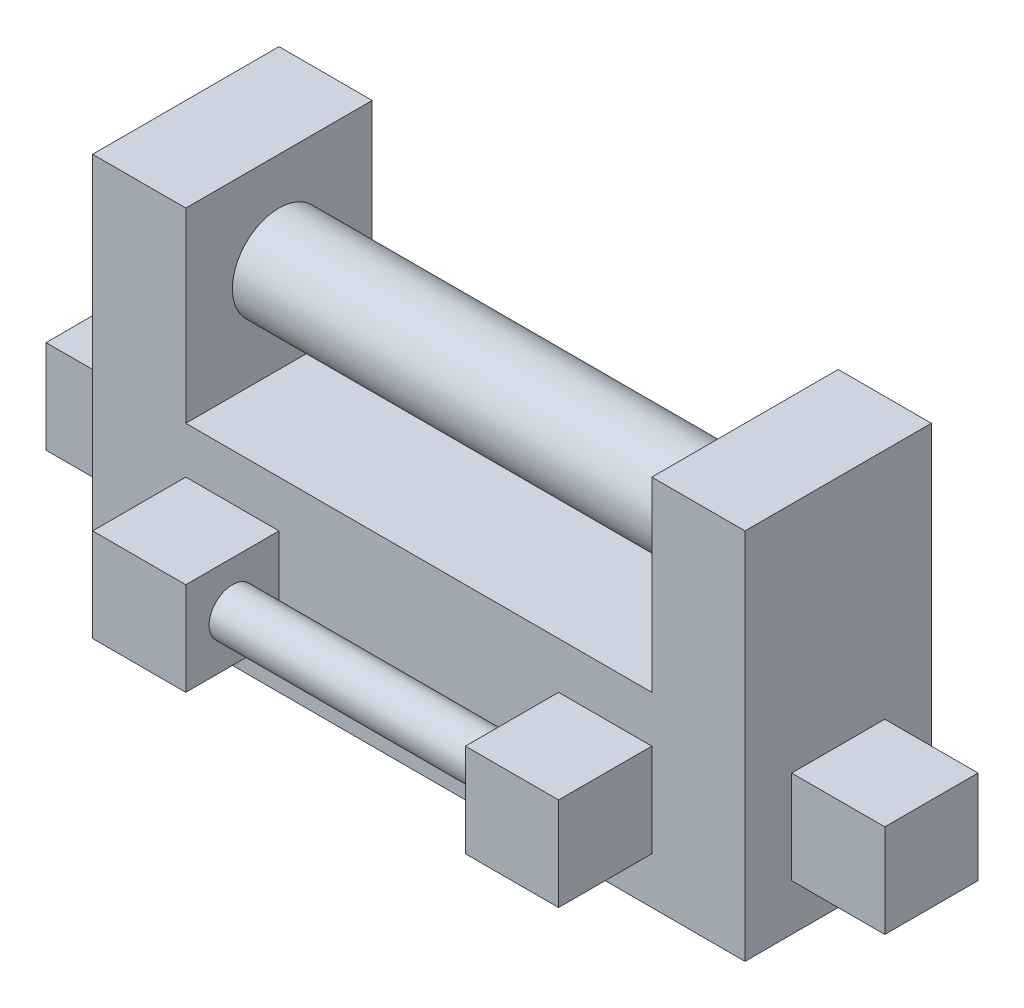
ISO-10303-21;
HEADER;
FILE_DESCRIPTION(('STEP AP214'),'2;1');
FILE_NAME('part.step','',(''),(''),'','','');
FILE_SCHEMA(('AUTOMOTIVE_DESIGN { 1 0 10303 214 1 1 1 1 }'));
ENDSEC;
DATA;
#1=APPLICATION_CONTEXT('core data for automotive mechanical design processes');
#2=APPLICATION_PROTOCOL_DEFINITION('international standard','automotive_design',2000,#1);
#3=PRODUCT_CONTEXT('',#1,'mechanical');
#4=PRODUCT('Part','Part','',(#3));
#5=PRODUCT_RELATED_PRODUCT_CATEGORY('part','',(#4));
#6=PRODUCT_DEFINITION_FORMATION('','',#4);
#7=PRODUCT_DEFINITION_CONTEXT('part definition',#1,'design');
#8=PRODUCT_DEFINITION('design','',#6,#7);
#9=PRODUCT_DEFINITION_SHAPE('','',#8);
#10=(LENGTH_UNIT() NAMED_UNIT(*) SI_UNIT(.MILLI.,.METRE.));
#11=(NAMED_UNIT(*) PLANE_ANGLE_UNIT() SI_UNIT($,.RADIAN.));
#12=(NAMED_UNIT(*) SI_UNIT($,.STERADIAN.) SOLID_ANGLE_UNIT());
#13=UNCERTAINTY_MEASURE_WITH_UNIT(LENGTH_MEASURE(1.E-05),#10,'distance_accuracy_value','');
#14=(GEOMETRIC_REPRESENTATION_CONTEXT(3) GLOBAL_UNCERTAINTY_ASSIGNED_CONTEXT((#13)) GLOBAL_UNIT_ASSIGNED_CONTEXT((#10,
#11,#12)) REPRESENTATION_CONTEXT('',''));
#15=CARTESIAN_POINT('',(0.,0.,0.));
#16=DIRECTION('',(0.,0.,1.));
#17=DIRECTION('',(1.,0.,0.));
#18=AXIS2_PLACEMENT_3D('',#15,#16,#17);
#19=CARTESIAN_POINT('',(0.,0.,10.));
#20=DIRECTION('',(0.,-1.,0.));
#21=DIRECTION('',(1.,0.,0.));
#22=AXIS2_PLACEMENT_3D('',#19,#20,#21);
#23=PLANE('',#22);
#24=DIRECTION('',(-1.,0.,0.));
#25=VECTOR('',#24,1.);
#26=CARTESIAN_POINT('',(0.,0.,-10.));
#27=LINE('',#26,#25);
#28=CARTESIAN_POINT('',(70.,0.,-10.));
#29=VERTEX_POINT('',#28);
#30=CARTESIAN_POINT('',(0.,0.,-10.));
#31=VERTEX_POINT('',#30);
#32=EDGE_CURVE('E440',#29,#31,#27,.T.);
#33=ORIENTED_EDGE('',*,*,#32,.F.);
#34=DIRECTION('',(0.,0.,-1.));
#35=VECTOR('',#34,1.);
#36=CARTESIAN_POINT('',(70.,0.,10.));
#37=LINE('',#36,#35);
#38=CARTESIAN_POINT('',(70.,0.,10.));
#39=VERTEX_POINT('',#38);
#40=EDGE_CURVE('E476',#39,#29,#37,.T.);
#41=ORIENTED_EDGE('',*,*,#40,.F.);
#42=DIRECTION('',(-1.,0.,0.));
#43=VECTOR('',#42,1.);
#44=CARTESIAN_POINT('',(0.,0.,10.));
#45=LINE('',#44,#43);
#46=CARTESIAN_POINT('',(0.,0.,10.));
#47=VERTEX_POINT('',#46);
#48=EDGE_CURVE('E396',#39,#47,#45,.T.);
#49=ORIENTED_EDGE('',*,*,#48,.T.);
#50=DIRECTION('',(0.,0.,-1.));
#51=VECTOR('',#50,1.);
#52=CARTESIAN_POINT('',(0.,0.,10.));
#53=LINE('',#52,#51);
#54=EDGE_CURVE('E420',#47,#31,#53,.T.);
#55=ORIENTED_EDGE('',*,*,#54,.T.);
#56=EDGE_LOOP('',(#33,#41,#49,#55));
#57=FACE_BOUND('',#56,.T.);
#58=ADVANCED_FACE('F39',(#57),#23,.T.);
#59=CARTESIAN_POINT('',(70.,0.,10.));
#60=DIRECTION('',(1.,0.,0.));
#61=DIRECTION('',(0.,0.,-1.));
#62=AXIS2_PLACEMENT_3D('',#59,#60,#61);
#63=PLANE('',#62);
#64=DIRECTION('',(0.,-1.,0.));
#65=VECTOR('',#64,1.);
#66=CARTESIAN_POINT('',(70.,0.,5.));
#67=LINE('',#66,#65);
#68=CARTESIAN_POINT('',(70.,15.,5.));
#69=VERTEX_POINT('',#68);
#70=CARTESIAN_POINT('',(70.,5.,5.));
#71=VERTEX_POINT('',#70);
#72=EDGE_CURVE('E354',#69,#71,#67,.T.);
#73=ORIENTED_EDGE('',*,*,#72,.F.);
#74=DIRECTION('',(0.,0.,-1.));
#75=VECTOR('',#74,1.);
#76=CARTESIAN_POINT('',(70.,15.,5.));
#77=LINE('',#76,#75);
#78=CARTESIAN_POINT('',(70.,15.,-5.));
#79=VERTEX_POINT('',#78);
#80=EDGE_CURVE('E367',#69,#79,#77,.T.);
#81=ORIENTED_EDGE('',*,*,#80,.T.);
#82=DIRECTION('',(0.,-1.,0.));
#83=VECTOR('',#82,1.);
#84=CARTESIAN_POINT('',(70.,0.,-5.));
#85=LINE('',#84,#83);
#86=CARTESIAN_POINT('',(70.,5.,-5.));
#87=VERTEX_POINT('',#86);
#88=EDGE_CURVE('E349',#79,#87,#85,.T.);
#89=ORIENTED_EDGE('',*,*,#88,.T.);
#90=DIRECTION('',(0.,0.,-1.));
#91=VECTOR('',#90,1.);
#92=CARTESIAN_POINT('',(70.,5.,5.));
#93=LINE('',#92,#91);
#94=EDGE_CURVE('E356',#71,#87,#93,.T.);
#95=ORIENTED_EDGE('',*,*,#94,.F.);
#96=EDGE_LOOP('',(#73,#81,#89,#95));
#97=FACE_BOUND('',#96,.T.);
#98=DIRECTION('',(0.,-1.,0.));
#99=VECTOR('',#98,1.);
#100=CARTESIAN_POINT('',(70.,0.,-10.));
#101=LINE('',#100,#99);
#102=CARTESIAN_POINT('',(70.,40.,-10.));
#103=VERTEX_POINT('',#102);
#104=EDGE_CURVE('E443',#103,#29,#101,.T.);
#105=ORIENTED_EDGE('',*,*,#104,.F.);
#106=DIRECTION('',(0.,0.,-1.));
#107=VECTOR('',#106,1.);
#108=CARTESIAN_POINT('',(70.,40.,10.));
#109=LINE('',#108,#107);
#110=CARTESIAN_POINT('',(70.,40.,10.));
#111=VERTEX_POINT('',#110);
#112=EDGE_CURVE('E474',#111,#103,#109,.T.);
#113=ORIENTED_EDGE('',*,*,#112,.F.);
#114=DIRECTION('',(0.,-1.,0.));
#115=VECTOR('',#114,1.);
#116=CARTESIAN_POINT('',(70.,0.,10.));
#117=LINE('',#116,#115);
#118=EDGE_CURVE('E399',#111,#39,#117,.T.);
#119=ORIENTED_EDGE('',*,*,#118,.T.);
#120=ORIENTED_EDGE('',*,*,#40,.T.);
#121=EDGE_LOOP('',(#105,#113,#119,#120));
#122=FACE_BOUND('',#121,.T.);
#123=ADVANCED_FACE('F521',(#97,#122),#63,.T.);
#124=CARTESIAN_POINT('',(0.,40.,10.));
#125=DIRECTION('',(0.,1.,0.));
#126=DIRECTION('',(0.,0.,1.));
#127=AXIS2_PLACEMENT_3D('',#124,#125,#126);
#128=PLANE('',#127);
#129=DIRECTION('',(1.,0.,0.));
#130=VECTOR('',#129,1.);
#131=CARTESIAN_POINT('',(0.,40.,-10.));
#132=LINE('',#131,#130);
#133=CARTESIAN_POINT('',(60.,40.,-10.));
#134=VERTEX_POINT('',#133);
#135=EDGE_CURVE('E446',#134,#103,#132,.T.);
#136=ORIENTED_EDGE('',*,*,#135,.F.);
#137=DIRECTION('',(0.,0.,-1.));
#138=VECTOR('',#137,1.);
#139=CARTESIAN_POINT('',(60.,40.,10.));
#140=LINE('',#139,#138);
#141=CARTESIAN_POINT('',(60.,40.,10.));
#142=VERTEX_POINT('',#141);
#143=EDGE_CURVE('E472',#142,#134,#140,.T.);
#144=ORIENTED_EDGE('',*,*,#143,.F.);
#145=DIRECTION('',(1.,0.,0.));
#146=VECTOR('',#145,1.);
#147=CARTESIAN_POINT('',(0.,40.,10.));
#148=LINE('',#147,#146);
#149=EDGE_CURVE('E402',#142,#111,#148,.T.);
#150=ORIENTED_EDGE('',*,*,#149,.T.);
#151=ORIENTED_EDGE('',*,*,#112,.T.);
#152=EDGE_LOOP('',(#136,#144,#150,#151));
#153=FACE_BOUND('',#152,.T.);
#154=ADVANCED_FACE('F526',(#153),#128,.T.);
#155=CARTESIAN_POINT('',(60.,0.,10.));
#156=DIRECTION('',(-1.,0.,0.));
#157=DIRECTION('',(0.,0.,1.));
#158=AXIS2_PLACEMENT_3D('',#155,#156,#157);
#159=PLANE('',#158);
#160=CARTESIAN_POINT('',(60.,30.,0.));
#161=DIRECTION('',(-1.,0.,0.));
#162=DIRECTION('',(0.,0.,1.));
#163=AXIS2_PLACEMENT_3D('',#160,#161,#162);
#164=CIRCLE('',#163,5.);
#165=CARTESIAN_POINT('',(60.,30.,5.));
#166=VERTEX_POINT('',#165);
#167=EDGE_CURVE('E1005',#166,#166,#164,.T.);
#168=ORIENTED_EDGE('',*,*,#167,.F.);
#169=EDGE_LOOP('',(#168));
#170=FACE_BOUND('',#169,.T.);
#171=DIRECTION('',(0.,1.,0.));
#172=VECTOR('',#171,1.);
#173=CARTESIAN_POINT('',(60.,0.,-10.));
#174=LINE('',#173,#172);
#175=CARTESIAN_POINT('',(60.,20.,-10.));
#176=VERTEX_POINT('',#175);
#177=EDGE_CURVE('E449',#176,#134,#174,.T.);
#178=ORIENTED_EDGE('',*,*,#177,.F.);
#179=DIRECTION('',(0.,0.,-1.));
#180=VECTOR('',#179,1.);
#181=CARTESIAN_POINT('',(60.,20.,10.));
#182=LINE('',#181,#180);
#183=CARTESIAN_POINT('',(60.,20.,10.));
#184=VERTEX_POINT('',#183);
#185=EDGE_CURVE('E470',#184,#176,#182,.T.);
#186=ORIENTED_EDGE('',*,*,#185,.F.);
#187=DIRECTION('',(0.,1.,0.));
#188=VECTOR('',#187,1.);
#189=CARTESIAN_POINT('',(60.,0.,10.));
#190=LINE('',#189,#188);
#191=EDGE_CURVE('E405',#184,#142,#190,.T.);
#192=ORIENTED_EDGE('',*,*,#191,.T.);
#193=ORIENTED_EDGE('',*,*,#143,.T.);
#194=EDGE_LOOP('',(#178,#186,#192,#193));
#195=FACE_BOUND('',#194,.T.);
#196=ADVANCED_FACE('F543',(#170,#195),#159,.T.);
#197=CARTESIAN_POINT('',(0.,20.,10.));
#198=DIRECTION('',(0.,1.,0.));
#199=DIRECTION('',(0.,0.,1.));
#200=AXIS2_PLACEMENT_3D('',#197,#198,#199);
#201=PLANE('',#200);
#202=DIRECTION('',(1.,0.,0.));
#203=VECTOR('',#202,1.);
#204=CARTESIAN_POINT('',(0.,20.,-10.));
#205=LINE('',#204,#203);
#206=CARTESIAN_POINT('',(10.,20.,-10.));
#207=VERTEX_POINT('',#206);
#208=EDGE_CURVE('E452',#207,#176,#205,.T.);
#209=ORIENTED_EDGE('',*,*,#208,.F.);
#210=DIRECTION('',(0.,0.,-1.));
#211=VECTOR('',#210,1.);
#212=CARTESIAN_POINT('',(10.,20.,10.));
#213=LINE('',#212,#211);
#214=CARTESIAN_POINT('',(10.,20.,10.));
#215=VERTEX_POINT('',#214);
#216=EDGE_CURVE('E468',#215,#207,#213,.T.);
#217=ORIENTED_EDGE('',*,*,#216,.F.);
#218=DIRECTION('',(1.,0.,0.));
#219=VECTOR('',#218,1.);
#220=CARTESIAN_POINT('',(0.,20.,10.));
#221=LINE('',#220,#219);
#222=EDGE_CURVE('E408',#215,#184,#221,.T.);
#223=ORIENTED_EDGE('',*,*,#222,.T.);
#224=ORIENTED_EDGE('',*,*,#185,.T.);
#225=EDGE_LOOP('',(#209,#217,#223,#224));
#226=FACE_BOUND('',#225,.T.);
#227=ADVANCED_FACE('F548',(#226),#201,.T.);
#228=CARTESIAN_POINT('',(10.,0.,10.));
#229=DIRECTION('',(1.,0.,0.));
#230=DIRECTION('',(0.,1.,0.));
#231=AXIS2_PLACEMENT_3D('',#228,#229,#230);
#232=PLANE('',#231);
#233=CARTESIAN_POINT('',(10.,30.,0.));
#234=DIRECTION('',(1.,0.,0.));
#235=DIRECTION('',(0.,1.,0.));
#236=AXIS2_PLACEMENT_3D('',#233,#234,#235);
#237=CIRCLE('',#236,5.);
#238=CARTESIAN_POINT('',(10.,35.,0.));
#239=VERTEX_POINT('',#238);
#240=EDGE_CURVE('E1007',#239,#239,#237,.T.);
#241=ORIENTED_EDGE('',*,*,#240,.F.);
#242=EDGE_LOOP('',(#241));
#243=FACE_BOUND('',#242,.T.);
#244=DIRECTION('',(0.,-1.,0.));
#245=VECTOR('',#244,1.);
#246=CARTESIAN_POINT('',(10.,0.,-10.));
#247=LINE('',#246,#245);
#248=CARTESIAN_POINT('',(10.,40.,-10.));
#249=VERTEX_POINT('',#248);
#250=EDGE_CURVE('E455',#249,#207,#247,.T.);
#251=ORIENTED_EDGE('',*,*,#250,.F.);
#252=DIRECTION('',(0.,0.,-1.));
#253=VECTOR('',#252,1.);
#254=CARTESIAN_POINT('',(10.,40.,10.));
#255=LINE('',#254,#253);
#256=CARTESIAN_POINT('',(10.,40.,10.));
#257=VERTEX_POINT('',#256);
#258=EDGE_CURVE('E466',#257,#249,#255,.T.);
#259=ORIENTED_EDGE('',*,*,#258,.F.);
#260=DIRECTION('',(0.,-1.,0.));
#261=VECTOR('',#260,1.);
#262=CARTESIAN_POINT('',(10.,0.,10.));
#263=LINE('',#262,#261);
#264=EDGE_CURVE('E411',#257,#215,#263,.T.);
#265=ORIENTED_EDGE('',*,*,#264,.T.);
#266=ORIENTED_EDGE('',*,*,#216,.T.);
#267=EDGE_LOOP('',(#251,#259,#265,#266));
#268=FACE_BOUND('',#267,.T.);
#269=ADVANCED_FACE('F551',(#243,#268),#232,.T.);
#270=CARTESIAN_POINT('',(0.,40.,10.));
#271=DIRECTION('',(0.,1.,0.));
#272=DIRECTION('',(0.,0.,1.));
#273=AXIS2_PLACEMENT_3D('',#270,#271,#272);
#274=PLANE('',#273);
#275=DIRECTION('',(1.,0.,0.));
#276=VECTOR('',#275,1.);
#277=CARTESIAN_POINT('',(0.,40.,-10.));
#278=LINE('',#277,#276);
#279=CARTESIAN_POINT('',(0.,40.,-10.));
#280=VERTEX_POINT('',#279);
#281=EDGE_CURVE('E458',#280,#249,#278,.T.);
#282=ORIENTED_EDGE('',*,*,#281,.F.);
#283=DIRECTION('',(0.,0.,-1.));
#284=VECTOR('',#283,1.);
#285=CARTESIAN_POINT('',(0.,40.,10.));
#286=LINE('',#285,#284);
#287=CARTESIAN_POINT('',(0.,40.,10.));
#288=VERTEX_POINT('',#287);
#289=EDGE_CURVE('E464',#288,#280,#286,.T.);
#290=ORIENTED_EDGE('',*,*,#289,.F.);
#291=DIRECTION('',(1.,0.,0.));
#292=VECTOR('',#291,1.);
#293=CARTESIAN_POINT('',(0.,40.,10.));
#294=LINE('',#293,#292);
#295=EDGE_CURVE('E414',#288,#257,#294,.T.);
#296=ORIENTED_EDGE('',*,*,#295,.T.);
#297=ORIENTED_EDGE('',*,*,#258,.T.);
#298=EDGE_LOOP('',(#282,#290,#296,#297));
#299=FACE_BOUND('',#298,.T.);
#300=ADVANCED_FACE('F555',(#299),#274,.T.);
#301=CARTESIAN_POINT('',(0.,0.,10.));
#302=DIRECTION('',(-1.,0.,0.));
#303=DIRECTION('',(0.,0.,1.));
#304=AXIS2_PLACEMENT_3D('',#301,#302,#303);
#305=PLANE('',#304);
#306=DIRECTION('',(0.,1.,0.));
#307=VECTOR('',#306,1.);
#308=CARTESIAN_POINT('',(0.,0.,5.));
#309=LINE('',#308,#307);
#310=CARTESIAN_POINT('',(0.,4.99999999999999,5.));
#311=VERTEX_POINT('',#310);
#312=CARTESIAN_POINT('',(0.,15.,5.));
#313=VERTEX_POINT('',#312);
#314=EDGE_CURVE('E324',#311,#313,#309,.T.);
#315=ORIENTED_EDGE('',*,*,#314,.F.);
#316=DIRECTION('',(0.,0.,-1.));
#317=VECTOR('',#316,1.);
#318=CARTESIAN_POINT('',(0.,4.99999999999999,5.));
#319=LINE('',#318,#317);
#320=CARTESIAN_POINT('',(0.,4.99999999999999,-5.));
#321=VERTEX_POINT('',#320);
#322=EDGE_CURVE('E340',#311,#321,#319,.T.);
#323=ORIENTED_EDGE('',*,*,#322,.T.);
#324=DIRECTION('',(0.,1.,0.));
#325=VECTOR('',#324,1.);
#326=CARTESIAN_POINT('',(0.,0.,-5.));
#327=LINE('',#326,#325);
#328=CARTESIAN_POINT('',(0.,15.,-5.));
#329=VERTEX_POINT('',#328);
#330=EDGE_CURVE('E333',#321,#329,#327,.T.);
#331=ORIENTED_EDGE('',*,*,#330,.T.);
#332=DIRECTION('',(0.,0.,-1.));
#333=VECTOR('',#332,1.);
#334=CARTESIAN_POINT('',(0.,15.,5.));
#335=LINE('',#334,#333);
#336=EDGE_CURVE('E338',#313,#329,#335,.T.);
#337=ORIENTED_EDGE('',*,*,#336,.F.);
#338=EDGE_LOOP('',(#315,#323,#331,#337));
#339=FACE_BOUND('',#338,.T.);
#340=DIRECTION('',(0.,1.,0.));
#341=VECTOR('',#340,1.);
#342=CARTESIAN_POINT('',(0.,0.,-10.));
#343=LINE('',#342,#341);
#344=EDGE_CURVE('E378',#31,#280,#343,.T.);
#345=ORIENTED_EDGE('',*,*,#344,.F.);
#346=ORIENTED_EDGE('',*,*,#54,.F.);
#347=DIRECTION('',(0.,1.,0.));
#348=VECTOR('',#347,1.);
#349=CARTESIAN_POINT('',(0.,0.,10.));
#350=LINE('',#349,#348);
#351=EDGE_CURVE('E417',#47,#288,#350,.T.);
#352=ORIENTED_EDGE('',*,*,#351,.T.);
#353=ORIENTED_EDGE('',*,*,#289,.T.);
#354=EDGE_LOOP('',(#345,#346,#352,#353));
#355=FACE_BOUND('',#354,.T.);
#356=ADVANCED_FACE('F557',(#339,#355),#305,.T.);
#357=CARTESIAN_POINT('',(0.,0.,10.));
#358=DIRECTION('',(0.,0.,1.));
#359=DIRECTION('',(1.,0.,0.));
#360=AXIS2_PLACEMENT_3D('',#357,#358,#359);
#361=PLANE('',#360);
#362=DIRECTION('',(0.,1.,0.));
#363=VECTOR('',#362,1.);
#364=CARTESIAN_POINT('',(60.,0.,10.));
#365=LINE('',#364,#363);
#366=CARTESIAN_POINT('',(60.,4.99999999999999,10.));
#367=VERTEX_POINT('',#366);
#368=CARTESIAN_POINT('',(60.,15.,10.));
#369=VERTEX_POINT('',#368);
#370=EDGE_CURVE('E376',#367,#369,#365,.T.);
#371=ORIENTED_EDGE('',*,*,#370,.F.);
#372=DIRECTION('',(1.,0.,0.));
#373=VECTOR('',#372,1.);
#374=CARTESIAN_POINT('',(0.,4.99999999999999,10.));
#375=LINE('',#374,#373);
#376=CARTESIAN_POINT('',(50.,4.99999999999999,10.));
#377=VERTEX_POINT('',#376);
#378=EDGE_CURVE('E273',#377,#367,#375,.T.);
#379=ORIENTED_EDGE('',*,*,#378,.F.);
#380=DIRECTION('',(0.,1.,0.));
#381=VECTOR('',#380,1.);
#382=CARTESIAN_POINT('',(50.,0.,10.));
#383=LINE('',#382,#381);
#384=CARTESIAN_POINT('',(50.,15.,10.));
#385=VERTEX_POINT('',#384);
#386=EDGE_CURVE('E380',#377,#385,#383,.T.);
#387=ORIENTED_EDGE('',*,*,#386,.T.);
#388=DIRECTION('',(1.,0.,0.));
#389=VECTOR('',#388,1.);
#390=CARTESIAN_POINT('',(0.,15.,10.));
#391=LINE('',#390,#389);
#392=EDGE_CURVE('E383',#385,#369,#391,.T.);
#393=ORIENTED_EDGE('',*,*,#392,.T.);
#394=EDGE_LOOP('',(#371,#379,#387,#393));
#395=FACE_BOUND('',#394,.T.);
#396=DIRECTION('',(0.,1.,0.));
#397=VECTOR('',#396,1.);
#398=CARTESIAN_POINT('',(20.,0.,10.));
#399=LINE('',#398,#397);
#400=CARTESIAN_POINT('',(20.,4.99999999999999,10.));
#401=VERTEX_POINT('',#400);
#402=CARTESIAN_POINT('',(20.,15.,10.));
#403=VERTEX_POINT('',#402);
#404=EDGE_CURVE('E386',#401,#403,#399,.T.);
#405=ORIENTED_EDGE('',*,*,#404,.F.);
#406=DIRECTION('',(1.,0.,0.));
#407=VECTOR('',#406,1.);
#408=CARTESIAN_POINT('',(0.,4.99999999999999,10.));
#409=LINE('',#408,#407);
#410=CARTESIAN_POINT('',(10.,4.99999999999999,10.));
#411=VERTEX_POINT('',#410);
#412=EDGE_CURVE('E388',#411,#401,#409,.T.);
#413=ORIENTED_EDGE('',*,*,#412,.F.);
#414=DIRECTION('',(0.,1.,0.));
#415=VECTOR('',#414,1.);
#416=CARTESIAN_POINT('',(10.,0.,10.));
#417=LINE('',#416,#415);
#418=CARTESIAN_POINT('',(10.,15.,10.));
#419=VERTEX_POINT('',#418);
#420=EDGE_CURVE('E390',#411,#419,#417,.T.);
#421=ORIENTED_EDGE('',*,*,#420,.T.);
#422=DIRECTION('',(1.,0.,0.));
#423=VECTOR('',#422,1.);
#424=CARTESIAN_POINT('',(0.,15.,10.));
#425=LINE('',#424,#423);
#426=EDGE_CURVE('E393',#419,#403,#425,.T.);
#427=ORIENTED_EDGE('',*,*,#426,.T.);
#428=EDGE_LOOP('',(#405,#413,#421,#427));
#429=FACE_BOUND('',#428,.T.);
#430=ORIENTED_EDGE('',*,*,#48,.F.);
#431=ORIENTED_EDGE('',*,*,#118,.F.);
#432=ORIENTED_EDGE('',*,*,#149,.F.);
#433=ORIENTED_EDGE('',*,*,#191,.F.);
#434=ORIENTED_EDGE('',*,*,#222,.F.);
#435=ORIENTED_EDGE('',*,*,#264,.F.);
#436=ORIENTED_EDGE('',*,*,#295,.F.);
#437=ORIENTED_EDGE('',*,*,#351,.F.);
#438=EDGE_LOOP('',(#430,#431,#432,#433,#434,#435,#436,#437));
#439=FACE_BOUND('',#438,.T.);
#440=ADVANCED_FACE('F497',(#395,#429,#439),#361,.T.);
#441=CARTESIAN_POINT('',(0.,0.,-10.));
#442=DIRECTION('',(0.,0.,1.));
#443=DIRECTION('',(1.,0.,0.));
#444=AXIS2_PLACEMENT_3D('',#441,#442,#443);
#445=PLANE('',#444);
#446=DIRECTION('',(0.,1.,0.));
#447=VECTOR('',#446,1.);
#448=CARTESIAN_POINT('',(60.,0.,-10.));
#449=LINE('',#448,#447);
#450=CARTESIAN_POINT('',(60.,4.99999999999999,-10.));
#451=VERTEX_POINT('',#450);
#452=CARTESIAN_POINT('',(60.,15.,-10.));
#453=VERTEX_POINT('',#452);
#454=EDGE_CURVE('E375',#451,#453,#449,.T.);
#455=ORIENTED_EDGE('',*,*,#454,.T.);
#456=DIRECTION('',(1.,0.,0.));
#457=VECTOR('',#456,1.);
#458=CARTESIAN_POINT('',(0.,15.,-10.));
#459=LINE('',#458,#457);
#460=CARTESIAN_POINT('',(50.,15.,-10.));
#461=VERTEX_POINT('',#460);
#462=EDGE_CURVE('E427',#461,#453,#459,.T.);
#463=ORIENTED_EDGE('',*,*,#462,.F.);
#464=DIRECTION('',(0.,1.,0.));
#465=VECTOR('',#464,1.);
#466=CARTESIAN_POINT('',(50.,0.,-10.));
#467=LINE('',#466,#465);
#468=CARTESIAN_POINT('',(50.,4.99999999999999,-10.));
#469=VERTEX_POINT('',#468);
#470=EDGE_CURVE('E424',#469,#461,#467,.T.);
#471=ORIENTED_EDGE('',*,*,#470,.F.);
#472=DIRECTION('',(1.,0.,0.));
#473=VECTOR('',#472,1.);
#474=CARTESIAN_POINT('',(0.,4.99999999999999,-10.));
#475=LINE('',#474,#473);
#476=EDGE_CURVE('E422',#469,#451,#475,.T.);
#477=ORIENTED_EDGE('',*,*,#476,.T.);
#478=EDGE_LOOP('',(#455,#463,#471,#477));
#479=FACE_BOUND('',#478,.T.);
#480=DIRECTION('',(0.,1.,0.));
#481=VECTOR('',#480,1.);
#482=CARTESIAN_POINT('',(20.,0.,-10.));
#483=LINE('',#482,#481);
#484=CARTESIAN_POINT('',(20.,4.99999999999999,-10.));
#485=VERTEX_POINT('',#484);
#486=CARTESIAN_POINT('',(20.,15.,-10.));
#487=VERTEX_POINT('',#486);
#488=EDGE_CURVE('E430',#485,#487,#483,.T.);
#489=ORIENTED_EDGE('',*,*,#488,.T.);
#490=DIRECTION('',(1.,0.,0.));
#491=VECTOR('',#490,1.);
#492=CARTESIAN_POINT('',(0.,15.,-10.));
#493=LINE('',#492,#491);
#494=CARTESIAN_POINT('',(10.,15.,-10.));
#495=VERTEX_POINT('',#494);
#496=EDGE_CURVE('E437',#495,#487,#493,.T.);
#497=ORIENTED_EDGE('',*,*,#496,.F.);
#498=DIRECTION('',(0.,1.,0.));
#499=VECTOR('',#498,1.);
#500=CARTESIAN_POINT('',(10.,0.,-10.));
#501=LINE('',#500,#499);
#502=CARTESIAN_POINT('',(10.,4.99999999999999,-10.));
#503=VERTEX_POINT('',#502);
#504=EDGE_CURVE('E434',#503,#495,#501,.T.);
#505=ORIENTED_EDGE('',*,*,#504,.F.);
#506=DIRECTION('',(1.,0.,0.));
#507=VECTOR('',#506,1.);
#508=CARTESIAN_POINT('',(0.,4.99999999999999,-10.));
#509=LINE('',#508,#507);
#510=EDGE_CURVE('E432',#503,#485,#509,.T.);
#511=ORIENTED_EDGE('',*,*,#510,.T.);
#512=EDGE_LOOP('',(#489,#497,#505,#511));
#513=FACE_BOUND('',#512,.T.);
#514=ORIENTED_EDGE('',*,*,#32,.T.);
#515=ORIENTED_EDGE('',*,*,#344,.T.);
#516=ORIENTED_EDGE('',*,*,#281,.T.);
#517=ORIENTED_EDGE('',*,*,#250,.T.);
#518=ORIENTED_EDGE('',*,*,#208,.T.);
#519=ORIENTED_EDGE('',*,*,#177,.T.);
#520=ORIENTED_EDGE('',*,*,#135,.T.);
#521=ORIENTED_EDGE('',*,*,#104,.T.);
#522=EDGE_LOOP('',(#514,#515,#516,#517,#518,#519,#520,#521));
#523=FACE_BOUND('',#522,.T.);
#524=ADVANCED_FACE('F533',(#479,#513,#523),#445,.F.);
#525=CARTESIAN_POINT('',(0.,5.,5.));
#526=DIRECTION('',(0.,1.,0.));
#527=DIRECTION('',(0.,0.,1.));
#528=AXIS2_PLACEMENT_3D('',#525,#526,#527);
#529=PLANE('',#528);
#530=DIRECTION('',(1.,0.,0.));
#531=VECTOR('',#530,1.);
#532=CARTESIAN_POINT('',(0.,5.,-5.));
#533=LINE('',#532,#531);
#534=CARTESIAN_POINT('',(80.,5.,-5.));
#535=VERTEX_POINT('',#534);
#536=EDGE_CURVE('E61',#87,#535,#533,.T.);
#537=ORIENTED_EDGE('',*,*,#536,.T.);
#538=DIRECTION('',(0.,0.,-1.));
#539=VECTOR('',#538,1.);
#540=CARTESIAN_POINT('',(80.,5.,5.));
#541=LINE('',#540,#539);
#542=CARTESIAN_POINT('',(80.,5.,5.));
#543=VERTEX_POINT('',#542);
#544=EDGE_CURVE('E372',#543,#535,#541,.T.);
#545=ORIENTED_EDGE('',*,*,#544,.F.);
#546=DIRECTION('',(1.,0.,0.));
#547=VECTOR('',#546,1.);
#548=CARTESIAN_POINT('',(0.,5.,5.));
#549=LINE('',#548,#547);
#550=EDGE_CURVE('E345',#71,#543,#549,.T.);
#551=ORIENTED_EDGE('',*,*,#550,.F.);
#552=ORIENTED_EDGE('',*,*,#94,.T.);
#553=EDGE_LOOP('',(#537,#545,#551,#552));
#554=FACE_BOUND('',#553,.T.);
#555=ADVANCED_FACE('F619',(#554),#529,.F.);
#556=CARTESIAN_POINT('',(80.,0.,5.));
#557=DIRECTION('',(-1.,0.,0.));
#558=DIRECTION('',(0.,0.,1.));
#559=AXIS2_PLACEMENT_3D('',#556,#557,#558);
#560=PLANE('',#559);
#561=DIRECTION('',(0.,1.,0.));
#562=VECTOR('',#561,1.);
#563=CARTESIAN_POINT('',(80.,0.,-5.));
#564=LINE('',#563,#562);
#565=CARTESIAN_POINT('',(80.,15.,-5.));
#566=VERTEX_POINT('',#565);
#567=EDGE_CURVE('E358',#535,#566,#564,.T.);
#568=ORIENTED_EDGE('',*,*,#567,.T.);
#569=DIRECTION('',(0.,0.,-1.));
#570=VECTOR('',#569,1.);
#571=CARTESIAN_POINT('',(80.,15.,5.));
#572=LINE('',#571,#570);
#573=CARTESIAN_POINT('',(80.,15.,5.));
#574=VERTEX_POINT('',#573);
#575=EDGE_CURVE('E370',#574,#566,#572,.T.);
#576=ORIENTED_EDGE('',*,*,#575,.F.);
#577=DIRECTION('',(0.,1.,0.));
#578=VECTOR('',#577,1.);
#579=CARTESIAN_POINT('',(80.,0.,5.));
#580=LINE('',#579,#578);
#581=EDGE_CURVE('E348',#543,#574,#580,.T.);
#582=ORIENTED_EDGE('',*,*,#581,.F.);
#583=ORIENTED_EDGE('',*,*,#544,.T.);
#584=EDGE_LOOP('',(#568,#576,#582,#583));
#585=FACE_BOUND('',#584,.T.);
#586=ADVANCED_FACE('F624',(#585),#560,.F.);
#587=CARTESIAN_POINT('',(0.,15.,5.));
#588=DIRECTION('',(0.,1.,0.));
#589=DIRECTION('',(0.,0.,1.));
#590=AXIS2_PLACEMENT_3D('',#587,#588,#589);
#591=PLANE('',#590);
#592=DIRECTION('',(1.,0.,0.));
#593=VECTOR('',#592,1.);
#594=CARTESIAN_POINT('',(0.,15.,-5.));
#595=LINE('',#594,#593);
#596=EDGE_CURVE('E361',#79,#566,#595,.T.);
#597=ORIENTED_EDGE('',*,*,#596,.F.);
#598=ORIENTED_EDGE('',*,*,#80,.F.);
#599=DIRECTION('',(1.,0.,0.));
#600=VECTOR('',#599,1.);
#601=CARTESIAN_POINT('',(0.,15.,5.));
#602=LINE('',#601,#600);
#603=EDGE_CURVE('E351',#69,#574,#602,.T.);
#604=ORIENTED_EDGE('',*,*,#603,.T.);
#605=ORIENTED_EDGE('',*,*,#575,.T.);
#606=EDGE_LOOP('',(#597,#598,#604,#605));
#607=FACE_BOUND('',#606,.T.);
#608=ADVANCED_FACE('F637',(#607),#591,.T.);
#609=CARTESIAN_POINT('',(0.,0.,5.));
#610=DIRECTION('',(0.,0.,1.));
#611=DIRECTION('',(1.,0.,0.));
#612=AXIS2_PLACEMENT_3D('',#609,#610,#611);
#613=PLANE('',#612);
#614=ORIENTED_EDGE('',*,*,#550,.T.);
#615=ORIENTED_EDGE('',*,*,#581,.T.);
#616=ORIENTED_EDGE('',*,*,#603,.F.);
#617=ORIENTED_EDGE('',*,*,#72,.T.);
#618=EDGE_LOOP('',(#614,#615,#616,#617));
#619=FACE_BOUND('',#618,.T.);
#620=ADVANCED_FACE('F648',(#619),#613,.T.);
#621=CARTESIAN_POINT('',(0.,0.,-5.));
#622=DIRECTION('',(0.,0.,1.));
#623=DIRECTION('',(1.,0.,0.));
#624=AXIS2_PLACEMENT_3D('',#621,#622,#623);
#625=PLANE('',#624);
#626=ORIENTED_EDGE('',*,*,#536,.F.);
#627=ORIENTED_EDGE('',*,*,#88,.F.);
#628=ORIENTED_EDGE('',*,*,#596,.T.);
#629=ORIENTED_EDGE('',*,*,#567,.F.);
#630=EDGE_LOOP('',(#626,#627,#628,#629));
#631=FACE_BOUND('',#630,.T.);
#632=ADVANCED_FACE('F659',(#631),#625,.F.);
#633=CARTESIAN_POINT('',(-10.,0.,5.));
#634=DIRECTION('',(-1.,0.,0.));
#635=DIRECTION('',(0.,0.,1.));
#636=AXIS2_PLACEMENT_3D('',#633,#634,#635);
#637=PLANE('',#636);
#638=DIRECTION('',(0.,1.,0.));
#639=VECTOR('',#638,1.);
#640=CARTESIAN_POINT('',(-10.,0.,-5.));
#641=LINE('',#640,#639);
#642=CARTESIAN_POINT('',(-10.,4.99999999999999,-5.));
#643=VERTEX_POINT('',#642);
#644=CARTESIAN_POINT('',(-10.,15.,-5.));
#645=VERTEX_POINT('',#644);
#646=EDGE_CURVE('E317',#643,#645,#641,.T.);
#647=ORIENTED_EDGE('',*,*,#646,.F.);
#648=DIRECTION('',(0.,0.,-1.));
#649=VECTOR('',#648,1.);
#650=CARTESIAN_POINT('',(-10.,4.99999999999999,5.));
#651=LINE('',#650,#649);
#652=CARTESIAN_POINT('',(-10.,4.99999999999999,5.));
#653=VERTEX_POINT('',#652);
#654=EDGE_CURVE('E343',#653,#643,#651,.T.);
#655=ORIENTED_EDGE('',*,*,#654,.F.);
#656=DIRECTION('',(0.,1.,0.));
#657=VECTOR('',#656,1.);
#658=CARTESIAN_POINT('',(-10.,0.,5.));
#659=LINE('',#658,#657);
#660=CARTESIAN_POINT('',(-10.,15.,5.));
#661=VERTEX_POINT('',#660);
#662=EDGE_CURVE('E318',#653,#661,#659,.T.);
#663=ORIENTED_EDGE('',*,*,#662,.T.);
#664=DIRECTION('',(0.,0.,-1.));
#665=VECTOR('',#664,1.);
#666=CARTESIAN_POINT('',(-10.,15.,5.));
#667=LINE('',#666,#665);
#668=EDGE_CURVE('E328',#661,#645,#667,.T.);
#669=ORIENTED_EDGE('',*,*,#668,.T.);
#670=EDGE_LOOP('',(#647,#655,#663,#669));
#671=FACE_BOUND('',#670,.T.);
#672=ADVANCED_FACE('F670',(#671),#637,.T.);
#673=CARTESIAN_POINT('',(0.,4.99999999999999,5.));
#674=DIRECTION('',(0.,-1.,0.));
#675=DIRECTION('',(1.,0.,0.));
#676=AXIS2_PLACEMENT_3D('',#673,#674,#675);
#677=PLANE('',#676);
#678=DIRECTION('',(-1.,0.,0.));
#679=VECTOR('',#678,1.);
#680=CARTESIAN_POINT('',(0.,4.99999999999999,-5.));
#681=LINE('',#680,#679);
#682=EDGE_CURVE('E330',#321,#643,#681,.T.);
#683=ORIENTED_EDGE('',*,*,#682,.F.);
#684=ORIENTED_EDGE('',*,*,#322,.F.);
#685=DIRECTION('',(-1.,0.,0.));
#686=VECTOR('',#685,1.);
#687=CARTESIAN_POINT('',(0.,4.99999999999999,5.));
#688=LINE('',#687,#686);
#689=EDGE_CURVE('E321',#311,#653,#688,.T.);
#690=ORIENTED_EDGE('',*,*,#689,.T.);
#691=ORIENTED_EDGE('',*,*,#654,.T.);
#692=EDGE_LOOP('',(#683,#684,#690,#691));
#693=FACE_BOUND('',#692,.T.);
#694=ADVANCED_FACE('F680',(#693),#677,.T.);
#695=CARTESIAN_POINT('',(0.,15.,5.));
#696=DIRECTION('',(0.,-1.,0.));
#697=DIRECTION('',(1.,0.,0.));
#698=AXIS2_PLACEMENT_3D('',#695,#696,#697);
#699=PLANE('',#698);
#700=DIRECTION('',(-1.,0.,0.));
#701=VECTOR('',#700,1.);
#702=CARTESIAN_POINT('',(0.,15.,-5.));
#703=LINE('',#702,#701);
#704=EDGE_CURVE('E53',#329,#645,#703,.T.);
#705=ORIENTED_EDGE('',*,*,#704,.T.);
#706=ORIENTED_EDGE('',*,*,#668,.F.);
#707=DIRECTION('',(-1.,0.,0.));
#708=VECTOR('',#707,1.);
#709=CARTESIAN_POINT('',(0.,15.,5.));
#710=LINE('',#709,#708);
#711=EDGE_CURVE('E326',#313,#661,#710,.T.);
#712=ORIENTED_EDGE('',*,*,#711,.F.);
#713=ORIENTED_EDGE('',*,*,#336,.T.);
#714=EDGE_LOOP('',(#705,#706,#712,#713));
#715=FACE_BOUND('',#714,.T.);
#716=ADVANCED_FACE('F691',(#715),#699,.F.);
#717=CARTESIAN_POINT('',(0.,0.,5.));
#718=DIRECTION('',(0.,0.,1.));
#719=DIRECTION('',(1.,0.,0.));
#720=AXIS2_PLACEMENT_3D('',#717,#718,#719);
#721=PLANE('',#720);
#722=ORIENTED_EDGE('',*,*,#662,.F.);
#723=ORIENTED_EDGE('',*,*,#689,.F.);
#724=ORIENTED_EDGE('',*,*,#314,.T.);
#725=ORIENTED_EDGE('',*,*,#711,.T.);
#726=EDGE_LOOP('',(#722,#723,#724,#725));
#727=FACE_BOUND('',#726,.T.);
#728=ADVANCED_FACE('F702',(#727),#721,.T.);
#729=CARTESIAN_POINT('',(0.,0.,-5.));
#730=DIRECTION('',(0.,0.,1.));
#731=DIRECTION('',(1.,0.,0.));
#732=AXIS2_PLACEMENT_3D('',#729,#730,#731);
#733=PLANE('',#732);
#734=ORIENTED_EDGE('',*,*,#646,.T.);
#735=ORIENTED_EDGE('',*,*,#704,.F.);
#736=ORIENTED_EDGE('',*,*,#330,.F.);
#737=ORIENTED_EDGE('',*,*,#682,.T.);
#738=EDGE_LOOP('',(#734,#735,#736,#737));
#739=FACE_BOUND('',#738,.T.);
#740=ADVANCED_FACE('F713',(#739),#733,.F.);
#741=CARTESIAN_POINT('',(0.,0.,-20.));
#742=DIRECTION('',(0.,0.,1.));
#743=DIRECTION('',(1.,0.,0.));
#744=AXIS2_PLACEMENT_3D('',#741,#742,#743);
#745=PLANE('',#744);
#746=DIRECTION('',(1.,0.,0.));
#747=VECTOR('',#746,1.);
#748=CARTESIAN_POINT('',(0.,4.99999999999999,-20.));
#749=LINE('',#748,#747);
#750=CARTESIAN_POINT('',(10.,4.99999999999999,-20.));
#751=VERTEX_POINT('',#750);
#752=CARTESIAN_POINT('',(20.,4.99999999999999,-20.));
#753=VERTEX_POINT('',#752);
#754=EDGE_CURVE('E274',#751,#753,#749,.T.);
#755=ORIENTED_EDGE('',*,*,#754,.F.);
#756=DIRECTION('',(0.,1.,0.));
#757=VECTOR('',#756,1.);
#758=CARTESIAN_POINT('',(10.,0.,-20.));
#759=LINE('',#758,#757);
#760=CARTESIAN_POINT('',(10.,15.,-20.));
#761=VERTEX_POINT('',#760);
#762=EDGE_CURVE('E287',#751,#761,#759,.T.);
#763=ORIENTED_EDGE('',*,*,#762,.T.);
#764=DIRECTION('',(1.,0.,0.));
#765=VECTOR('',#764,1.);
#766=CARTESIAN_POINT('',(0.,15.,-20.));
#767=LINE('',#766,#765);
#768=CARTESIAN_POINT('',(20.,15.,-20.));
#769=VERTEX_POINT('',#768);
#770=EDGE_CURVE('E298',#761,#769,#767,.T.);
#771=ORIENTED_EDGE('',*,*,#770,.T.);
#772=DIRECTION('',(0.,1.,0.));
#773=VECTOR('',#772,1.);
#774=CARTESIAN_POINT('',(20.,0.,-20.));
#775=LINE('',#774,#773);
#776=EDGE_CURVE('E278',#753,#769,#775,.T.);
#777=ORIENTED_EDGE('',*,*,#776,.F.);
#778=EDGE_LOOP('',(#755,#763,#771,#777));
#779=FACE_BOUND('',#778,.T.);
#780=ADVANCED_FACE('F724',(#779),#745,.F.);
#781=CARTESIAN_POINT('',(10.,0.,20.));
#782=DIRECTION('',(-1.,0.,0.));
#783=DIRECTION('',(0.,0.,1.));
#784=AXIS2_PLACEMENT_3D('',#781,#782,#783);
#785=PLANE('',#784);
#786=ORIENTED_EDGE('',*,*,#504,.T.);
#787=DIRECTION('',(0.,0.,-1.));
#788=VECTOR('',#787,1.);
#789=CARTESIAN_POINT('',(10.,15.,20.));
#790=LINE('',#789,#788);
#791=EDGE_CURVE('E306',#495,#761,#790,.T.);
#792=ORIENTED_EDGE('',*,*,#791,.T.);
#793=ORIENTED_EDGE('',*,*,#762,.F.);
#794=DIRECTION('',(0.,0.,-1.));
#795=VECTOR('',#794,1.);
#796=CARTESIAN_POINT('',(10.,4.99999999999999,20.));
#797=LINE('',#796,#795);
#798=EDGE_CURVE('E294',#503,#751,#797,.T.);
#799=ORIENTED_EDGE('',*,*,#798,.F.);
#800=EDGE_LOOP('',(#786,#792,#793,#799));
#801=FACE_BOUND('',#800,.T.);
#802=ADVANCED_FACE('F517',(#801),#785,.T.);
#803=CARTESIAN_POINT('',(0.,15.,20.));
#804=DIRECTION('',(0.,1.,0.));
#805=DIRECTION('',(-1.,0.,0.));
#806=AXIS2_PLACEMENT_3D('',#803,#804,#805);
#807=PLANE('',#806);
#808=ORIENTED_EDGE('',*,*,#496,.T.);
#809=DIRECTION('',(0.,0.,-1.));
#810=VECTOR('',#809,1.);
#811=CARTESIAN_POINT('',(20.,15.,20.));
#812=LINE('',#811,#810);
#813=EDGE_CURVE('E309',#487,#769,#812,.T.);
#814=ORIENTED_EDGE('',*,*,#813,.T.);
#815=ORIENTED_EDGE('',*,*,#770,.F.);
#816=ORIENTED_EDGE('',*,*,#791,.F.);
#817=EDGE_LOOP('',(#808,#814,#815,#816));
#818=FACE_BOUND('',#817,.T.);
#819=ADVANCED_FACE('F756',(#818),#807,.T.);
#820=CARTESIAN_POINT('',(20.,0.,20.));
#821=DIRECTION('',(-1.,0.,0.));
#822=DIRECTION('',(0.,-1.,0.));
#823=AXIS2_PLACEMENT_3D('',#820,#821,#822);
#824=PLANE('',#823);
#825=CARTESIAN_POINT('',(20.,9.99999999999998,-15.));
#826=DIRECTION('',(-1.,0.,0.));
#827=DIRECTION('',(0.,1.,0.));
#828=AXIS2_PLACEMENT_3D('',#825,#826,#827);
#829=CIRCLE('',#828,2.5);
#830=CARTESIAN_POINT('',(20.,12.5,-15.));
#831=VERTEX_POINT('',#830);
#832=EDGE_CURVE('E1014',#831,#831,#829,.T.);
#833=ORIENTED_EDGE('',*,*,#832,.T.);
#834=EDGE_LOOP('',(#833));
#835=FACE_BOUND('',#834,.T.);
#836=ORIENTED_EDGE('',*,*,#813,.F.);
#837=ORIENTED_EDGE('',*,*,#488,.F.);
#838=DIRECTION('',(0.,0.,-1.));
#839=VECTOR('',#838,1.);
#840=CARTESIAN_POINT('',(20.,4.99999999999999,20.));
#841=LINE('',#840,#839);
#842=EDGE_CURVE('E313',#485,#753,#841,.T.);
#843=ORIENTED_EDGE('',*,*,#842,.T.);
#844=ORIENTED_EDGE('',*,*,#776,.T.);
#845=EDGE_LOOP('',(#836,#837,#843,#844));
#846=FACE_BOUND('',#845,.T.);
#847=ADVANCED_FACE('F488',(#835,#846),#824,.F.);
#848=CARTESIAN_POINT('',(0.,4.99999999999999,20.));
#849=DIRECTION('',(0.,1.,0.));
#850=DIRECTION('',(-1.,0.,0.));
#851=AXIS2_PLACEMENT_3D('',#848,#849,#850);
#852=PLANE('',#851);
#853=ORIENTED_EDGE('',*,*,#842,.F.);
#854=ORIENTED_EDGE('',*,*,#510,.F.);
#855=ORIENTED_EDGE('',*,*,#798,.T.);
#856=ORIENTED_EDGE('',*,*,#754,.T.);
#857=EDGE_LOOP('',(#853,#854,#855,#856));
#858=FACE_BOUND('',#857,.T.);
#859=ADVANCED_FACE('F774',(#858),#852,.F.);
#860=ORIENTED_EDGE('',*,*,#412,.T.);
#861=CARTESIAN_POINT('',(20.,4.99999999999999,20.));
#862=VERTEX_POINT('',#861);
#863=EDGE_CURVE('E314',#862,#401,#841,.T.);
#864=ORIENTED_EDGE('',*,*,#863,.F.);
#865=DIRECTION('',(1.,0.,0.));
#866=VECTOR('',#865,1.);
#867=CARTESIAN_POINT('',(0.,4.99999999999999,20.));
#868=LINE('',#867,#866);
#869=CARTESIAN_POINT('',(10.,4.99999999999999,20.));
#870=VERTEX_POINT('',#869);
#871=EDGE_CURVE('E283',#870,#862,#868,.T.);
#872=ORIENTED_EDGE('',*,*,#871,.F.);
#873=EDGE_CURVE('E303',#870,#411,#797,.T.);
#874=ORIENTED_EDGE('',*,*,#873,.T.);
#875=EDGE_LOOP('',(#860,#864,#872,#874));
#876=FACE_BOUND('',#875,.T.);
#877=ADVANCED_FACE('F486',(#876),#852,.F.);
#878=CARTESIAN_POINT('',(20.,9.99999999999998,15.));
#879=DIRECTION('',(-1.,0.,0.));
#880=DIRECTION('',(0.,-1.,0.));
#881=AXIS2_PLACEMENT_3D('',#878,#879,#880);
#882=CIRCLE('',#881,2.5);
#883=CARTESIAN_POINT('',(20.,7.49999999999998,15.));
#884=VERTEX_POINT('',#883);
#885=EDGE_CURVE('E46',#884,#884,#882,.F.);
#886=ORIENTED_EDGE('',*,*,#885,.F.);
#887=EDGE_LOOP('',(#886));
#888=FACE_BOUND('',#887,.T.);
#889=ORIENTED_EDGE('',*,*,#404,.T.);
#890=CARTESIAN_POINT('',(20.,15.,20.));
#891=VERTEX_POINT('',#890);
#892=EDGE_CURVE('E310',#891,#403,#812,.T.);
#893=ORIENTED_EDGE('',*,*,#892,.F.);
#894=DIRECTION('',(0.,1.,0.));
#895=VECTOR('',#894,1.);
#896=CARTESIAN_POINT('',(20.,0.,20.));
#897=LINE('',#896,#895);
#898=EDGE_CURVE('E286',#862,#891,#897,.T.);
#899=ORIENTED_EDGE('',*,*,#898,.F.);
#900=ORIENTED_EDGE('',*,*,#863,.T.);
#901=EDGE_LOOP('',(#889,#893,#899,#900));
#902=FACE_BOUND('',#901,.T.);
#903=ADVANCED_FACE('F482',(#888,#902),#824,.F.);
#904=ORIENTED_EDGE('',*,*,#892,.T.);
#905=ORIENTED_EDGE('',*,*,#426,.F.);
#906=CARTESIAN_POINT('',(10.,15.,20.));
#907=VERTEX_POINT('',#906);
#908=EDGE_CURVE('E307',#907,#419,#790,.T.);
#909=ORIENTED_EDGE('',*,*,#908,.F.);
#910=DIRECTION('',(1.,0.,0.));
#911=VECTOR('',#910,1.);
#912=CARTESIAN_POINT('',(0.,15.,20.));
#913=LINE('',#912,#911);
#914=EDGE_CURVE('E289',#907,#891,#913,.T.);
#915=ORIENTED_EDGE('',*,*,#914,.T.);
#916=EDGE_LOOP('',(#904,#905,#909,#915));
#917=FACE_BOUND('',#916,.T.);
#918=ADVANCED_FACE('F485',(#917),#807,.T.);
#919=ORIENTED_EDGE('',*,*,#908,.T.);
#920=ORIENTED_EDGE('',*,*,#420,.F.);
#921=ORIENTED_EDGE('',*,*,#873,.F.);
#922=DIRECTION('',(0.,1.,0.));
#923=VECTOR('',#922,1.);
#924=CARTESIAN_POINT('',(10.,0.,20.));
#925=LINE('',#924,#923);
#926=EDGE_CURVE('E292',#870,#907,#925,.T.);
#927=ORIENTED_EDGE('',*,*,#926,.T.);
#928=EDGE_LOOP('',(#919,#920,#921,#927));
#929=FACE_BOUND('',#928,.T.);
#930=ADVANCED_FACE('F500',(#929),#785,.T.);
#931=CARTESIAN_POINT('',(0.,0.,20.));
#932=DIRECTION('',(0.,0.,1.));
#933=DIRECTION('',(1.,0.,0.));
#934=AXIS2_PLACEMENT_3D('',#931,#932,#933);
#935=PLANE('',#934);
#936=ORIENTED_EDGE('',*,*,#871,.T.);
#937=ORIENTED_EDGE('',*,*,#898,.T.);
#938=ORIENTED_EDGE('',*,*,#914,.F.);
#939=ORIENTED_EDGE('',*,*,#926,.F.);
#940=EDGE_LOOP('',(#936,#937,#938,#939));
#941=FACE_BOUND('',#940,.T.);
#942=ADVANCED_FACE('F505',(#941),#935,.T.);
#943=CARTESIAN_POINT('',(0.,0.,-20.));
#944=DIRECTION('',(0.,0.,1.));
#945=DIRECTION('',(1.,0.,0.));
#946=AXIS2_PLACEMENT_3D('',#943,#944,#945);
#947=PLANE('',#946);
#948=DIRECTION('',(1.,0.,0.));
#949=VECTOR('',#948,1.);
#950=CARTESIAN_POINT('',(0.,4.99999999999999,-20.));
#951=LINE('',#950,#949);
#952=CARTESIAN_POINT('',(50.,4.99999999999999,-20.));
#953=VERTEX_POINT('',#952);
#954=CARTESIAN_POINT('',(60.,4.99999999999999,-20.));
#955=VERTEX_POINT('',#954);
#956=EDGE_CURVE('E992',#953,#955,#951,.T.);
#957=ORIENTED_EDGE('',*,*,#956,.F.);
#958=DIRECTION('',(0.,1.,0.));
#959=VECTOR('',#958,1.);
#960=CARTESIAN_POINT('',(50.,0.,-20.));
#961=LINE('',#960,#959);
#962=CARTESIAN_POINT('',(50.,15.,-20.));
#963=VERTEX_POINT('',#962);
#964=EDGE_CURVE('E269',#953,#963,#961,.T.);
#965=ORIENTED_EDGE('',*,*,#964,.T.);
#966=DIRECTION('',(1.,0.,0.));
#967=VECTOR('',#966,1.);
#968=CARTESIAN_POINT('',(0.,15.,-20.));
#969=LINE('',#968,#967);
#970=CARTESIAN_POINT('',(60.,15.,-20.));
#971=VERTEX_POINT('',#970);
#972=EDGE_CURVE('E984',#963,#971,#969,.T.);
#973=ORIENTED_EDGE('',*,*,#972,.T.);
#974=DIRECTION('',(0.,1.,0.));
#975=VECTOR('',#974,1.);
#976=CARTESIAN_POINT('',(60.,0.,-20.));
#977=LINE('',#976,#975);
#978=EDGE_CURVE('E988',#955,#971,#977,.T.);
#979=ORIENTED_EDGE('',*,*,#978,.F.);
#980=EDGE_LOOP('',(#957,#965,#973,#979));
#981=FACE_BOUND('',#980,.T.);
#982=ADVANCED_FACE('F507',(#981),#947,.F.);
#983=CARTESIAN_POINT('',(50.,0.,20.));
#984=DIRECTION('',(-1.,0.,0.));
#985=DIRECTION('',(0.,0.,1.));
#986=AXIS2_PLACEMENT_3D('',#983,#984,#985);
#987=PLANE('',#986);
#988=CARTESIAN_POINT('',(50.,9.99999999999999,-15.));
#989=DIRECTION('',(-1.,0.,0.));
#990=DIRECTION('',(0.,0.,1.));
#991=AXIS2_PLACEMENT_3D('',#988,#989,#990);
#992=CIRCLE('',#991,2.5);
#993=CARTESIAN_POINT('',(50.,9.99999999999999,-12.5));
#994=VERTEX_POINT('',#993);
#995=EDGE_CURVE('E11',#994,#994,#992,.T.);
#996=ORIENTED_EDGE('',*,*,#995,.F.);
#997=EDGE_LOOP('',(#996));
#998=FACE_BOUND('',#997,.T.);
#999=ORIENTED_EDGE('',*,*,#470,.T.);
#1000=DIRECTION('',(0.,0.,-1.));
#1001=VECTOR('',#1000,1.);
#1002=CARTESIAN_POINT('',(50.,15.,20.));
#1003=LINE('',#1002,#1001);
#1004=EDGE_CURVE('E978',#461,#963,#1003,.T.);
#1005=ORIENTED_EDGE('',*,*,#1004,.T.);
#1006=ORIENTED_EDGE('',*,*,#964,.F.);
#1007=DIRECTION('',(0.,0.,-1.));
#1008=VECTOR('',#1007,1.);
#1009=CARTESIAN_POINT('',(50.,4.99999999999999,20.));
#1010=LINE('',#1009,#1008);
#1011=EDGE_CURVE('E1000',#469,#953,#1010,.T.);
#1012=ORIENTED_EDGE('',*,*,#1011,.F.);
#1013=EDGE_LOOP('',(#999,#1005,#1006,#1012));
#1014=FACE_BOUND('',#1013,.T.);
#1015=ADVANCED_FACE('F513',(#998,#1014),#987,.T.);
#1016=CARTESIAN_POINT('',(0.,15.,20.));
#1017=DIRECTION('',(0.,1.,0.));
#1018=DIRECTION('',(-1.,0.,0.));
#1019=AXIS2_PLACEMENT_3D('',#1016,#1017,#1018);
#1020=PLANE('',#1019);
#1021=ORIENTED_EDGE('',*,*,#462,.T.);
#1022=DIRECTION('',(0.,0.,-1.));
#1023=VECTOR('',#1022,1.);
#1024=CARTESIAN_POINT('',(60.,15.,20.));
#1025=LINE('',#1024,#1023);
#1026=EDGE_CURVE('E977',#453,#971,#1025,.T.);
#1027=ORIENTED_EDGE('',*,*,#1026,.T.);
#1028=ORIENTED_EDGE('',*,*,#972,.F.);
#1029=ORIENTED_EDGE('',*,*,#1004,.F.);
#1030=EDGE_LOOP('',(#1021,#1027,#1028,#1029));
#1031=FACE_BOUND('',#1030,.T.);
#1032=ADVANCED_FACE('F823',(#1031),#1020,.T.);
#1033=CARTESIAN_POINT('',(60.,0.,20.));
#1034=DIRECTION('',(-1.,0.,0.));
#1035=DIRECTION('',(0.,-1.,0.));
#1036=AXIS2_PLACEMENT_3D('',#1033,#1034,#1035);
#1037=PLANE('',#1036);
#1038=ORIENTED_EDGE('',*,*,#1026,.F.);
#1039=ORIENTED_EDGE('',*,*,#454,.F.);
#1040=DIRECTION('',(0.,0.,-1.));
#1041=VECTOR('',#1040,1.);
#1042=CARTESIAN_POINT('',(60.,4.99999999999999,20.));
#1043=LINE('',#1042,#1041);
#1044=EDGE_CURVE('E275',#451,#955,#1043,.T.);
#1045=ORIENTED_EDGE('',*,*,#1044,.T.);
#1046=ORIENTED_EDGE('',*,*,#978,.T.);
#1047=EDGE_LOOP('',(#1038,#1039,#1045,#1046));
#1048=FACE_BOUND('',#1047,.T.);
#1049=ADVANCED_FACE('F828',(#1048),#1037,.F.);
#1050=CARTESIAN_POINT('',(0.,4.99999999999999,20.));
#1051=DIRECTION('',(0.,1.,0.));
#1052=DIRECTION('',(0.,0.,1.));
#1053=AXIS2_PLACEMENT_3D('',#1050,#1051,#1052);
#1054=PLANE('',#1053);
#1055=ORIENTED_EDGE('',*,*,#1044,.F.);
#1056=ORIENTED_EDGE('',*,*,#476,.F.);
#1057=ORIENTED_EDGE('',*,*,#1011,.T.);
#1058=ORIENTED_EDGE('',*,*,#956,.T.);
#1059=EDGE_LOOP('',(#1055,#1056,#1057,#1058));
#1060=FACE_BOUND('',#1059,.T.);
#1061=ADVANCED_FACE('F840',(#1060),#1054,.F.);
#1062=ORIENTED_EDGE('',*,*,#378,.T.);
#1063=CARTESIAN_POINT('',(60.,4.99999999999999,20.));
#1064=VERTEX_POINT('',#1063);
#1065=EDGE_CURVE('E252',#1064,#367,#1043,.T.);
#1066=ORIENTED_EDGE('',*,*,#1065,.F.);
#1067=DIRECTION('',(1.,0.,0.));
#1068=VECTOR('',#1067,1.);
#1069=CARTESIAN_POINT('',(0.,4.99999999999999,20.));
#1070=LINE('',#1069,#1068);
#1071=CARTESIAN_POINT('',(50.,4.99999999999999,20.));
#1072=VERTEX_POINT('',#1071);
#1073=EDGE_CURVE('E260',#1072,#1064,#1070,.T.);
#1074=ORIENTED_EDGE('',*,*,#1073,.F.);
#1075=EDGE_CURVE('E999',#1072,#377,#1010,.T.);
#1076=ORIENTED_EDGE('',*,*,#1075,.T.);
#1077=EDGE_LOOP('',(#1062,#1066,#1074,#1076));
#1078=FACE_BOUND('',#1077,.T.);
#1079=ADVANCED_FACE('F271',(#1078),#1054,.F.);
#1080=ORIENTED_EDGE('',*,*,#370,.T.);
#1081=CARTESIAN_POINT('',(60.,15.,20.));
#1082=VERTEX_POINT('',#1081);
#1083=EDGE_CURVE('E255',#1082,#369,#1025,.T.);
#1084=ORIENTED_EDGE('',*,*,#1083,.F.);
#1085=DIRECTION('',(0.,1.,0.));
#1086=VECTOR('',#1085,1.);
#1087=CARTESIAN_POINT('',(60.,0.,20.));
#1088=LINE('',#1087,#1086);
#1089=EDGE_CURVE('E248',#1064,#1082,#1088,.T.);
#1090=ORIENTED_EDGE('',*,*,#1089,.F.);
#1091=ORIENTED_EDGE('',*,*,#1065,.T.);
#1092=EDGE_LOOP('',(#1080,#1084,#1090,#1091));
#1093=FACE_BOUND('',#1092,.T.);
#1094=ADVANCED_FACE('F250',(#1093),#1037,.F.);
#1095=ORIENTED_EDGE('',*,*,#1083,.T.);
#1096=ORIENTED_EDGE('',*,*,#392,.F.);
#1097=CARTESIAN_POINT('',(50.,15.,20.));
#1098=VERTEX_POINT('',#1097);
#1099=EDGE_CURVE('E975',#1098,#385,#1003,.T.);
#1100=ORIENTED_EDGE('',*,*,#1099,.F.);
#1101=DIRECTION('',(1.,0.,0.));
#1102=VECTOR('',#1101,1.);
#1103=CARTESIAN_POINT('',(0.,15.,20.));
#1104=LINE('',#1103,#1102);
#1105=EDGE_CURVE('E259',#1098,#1082,#1104,.T.);
#1106=ORIENTED_EDGE('',*,*,#1105,.T.);
#1107=EDGE_LOOP('',(#1095,#1096,#1100,#1106));
#1108=FACE_BOUND('',#1107,.T.);
#1109=ADVANCED_FACE('F831',(#1108),#1020,.T.);
#1110=CARTESIAN_POINT('',(50.,9.99999999999999,15.));
#1111=DIRECTION('',(-1.,0.,0.));
#1112=DIRECTION('',(0.,0.,1.));
#1113=AXIS2_PLACEMENT_3D('',#1110,#1111,#1112);
#1114=CIRCLE('',#1113,2.5);
#1115=CARTESIAN_POINT('',(50.,9.99999999999999,17.5));
#1116=VERTEX_POINT('',#1115);
#1117=EDGE_CURVE('E974',#1116,#1116,#1114,.T.);
#1118=ORIENTED_EDGE('',*,*,#1117,.F.);
#1119=EDGE_LOOP('',(#1118));
#1120=FACE_BOUND('',#1119,.T.);
#1121=ORIENTED_EDGE('',*,*,#1099,.T.);
#1122=ORIENTED_EDGE('',*,*,#386,.F.);
#1123=ORIENTED_EDGE('',*,*,#1075,.F.);
#1124=DIRECTION('',(0.,1.,0.));
#1125=VECTOR('',#1124,1.);
#1126=CARTESIAN_POINT('',(50.,0.,20.));
#1127=LINE('',#1126,#1125);
#1128=EDGE_CURVE('E266',#1072,#1098,#1127,.T.);
#1129=ORIENTED_EDGE('',*,*,#1128,.T.);
#1130=EDGE_LOOP('',(#1121,#1122,#1123,#1129));
#1131=FACE_BOUND('',#1130,.T.);
#1132=ADVANCED_FACE('F875',(#1120,#1131),#987,.T.);
#1133=CARTESIAN_POINT('',(0.,0.,20.));
#1134=DIRECTION('',(0.,0.,1.));
#1135=DIRECTION('',(1.,0.,0.));
#1136=AXIS2_PLACEMENT_3D('',#1133,#1134,#1135);
#1137=PLANE('',#1136);
#1138=ORIENTED_EDGE('',*,*,#1073,.T.);
#1139=ORIENTED_EDGE('',*,*,#1089,.T.);
#1140=ORIENTED_EDGE('',*,*,#1105,.F.);
#1141=ORIENTED_EDGE('',*,*,#1128,.F.);
#1142=EDGE_LOOP('',(#1138,#1139,#1140,#1141));
#1143=FACE_BOUND('',#1142,.T.);
#1144=ADVANCED_FACE('F264',(#1143),#1137,.T.);
#1145=CARTESIAN_POINT('',(80.002,30.,0.));
#1146=DIRECTION('',(-1.,0.,0.));
#1147=DIRECTION('',(0.,-1.,0.));
#1148=AXIS2_PLACEMENT_3D('',#1145,#1146,#1147);
#1149=CYLINDRICAL_SURFACE('',#1148,5.);
#1150=ORIENTED_EDGE('',*,*,#167,.T.);
#1151=EDGE_LOOP('',(#1150));
#1152=FACE_BOUND('',#1151,.T.);
#1153=ORIENTED_EDGE('',*,*,#240,.T.);
#1154=EDGE_LOOP('',(#1153));
#1155=FACE_BOUND('',#1154,.T.);
#1156=ADVANCED_FACE('F886',(#1152,#1155),#1149,.T.);
#1157=CARTESIAN_POINT('',(80.002,10.,15.));
#1158=DIRECTION('',(-1.,0.,0.));
#1159=DIRECTION('',(0.,-1.,0.));
#1160=AXIS2_PLACEMENT_3D('',#1157,#1158,#1159);
#1161=CYLINDRICAL_SURFACE('',#1160,2.5);
#1162=ORIENTED_EDGE('',*,*,#1117,.T.);
#1163=EDGE_LOOP('',(#1162));
#1164=FACE_BOUND('',#1163,.T.);
#1165=ORIENTED_EDGE('',*,*,#885,.T.);
#1166=EDGE_LOOP('',(#1165));
#1167=FACE_BOUND('',#1166,.T.);
#1168=ADVANCED_FACE('F480',(#1164,#1167),#1161,.T.);
#1169=CARTESIAN_POINT('',(80.002,10.,-15.));
#1170=DIRECTION('',(-1.,0.,0.));
#1171=DIRECTION('',(0.,-1.,0.));
#1172=AXIS2_PLACEMENT_3D('',#1169,#1170,#1171);
#1173=CYLINDRICAL_SURFACE('',#1172,2.5);
#1174=ORIENTED_EDGE('',*,*,#995,.T.);
#1175=EDGE_LOOP('',(#1174));
#1176=FACE_BOUND('',#1175,.T.);
#1177=ORIENTED_EDGE('',*,*,#832,.F.);
#1178=EDGE_LOOP('',(#1177));
#1179=FACE_BOUND('',#1178,.T.);
#1180=ADVANCED_FACE('F905',(#1176,#1179),#1173,.T.);
#1181=CLOSED_SHELL('',(#58,#123,#154,#196,#227,#269,#300,#356,#440,#524,#555,#586,#608,#620,
#632,#672,#694,#716,#728,#740,#780,#802,#819,#847,#859,#877,#903,#918,#930,#942,#982,#1015,
#1032,#1049,#1061,#1079,#1094,#1109,#1132,#1144,#1156,#1168,#1180));
#1182=MANIFOLD_SOLID_BREP('B2',#1181);
#1183=ADVANCED_BREP_SHAPE_REPRESENTATION('',(#18,#1182),#14);
#1184=SHAPE_DEFINITION_REPRESENTATION(#9,#1183);
ENDSEC;
END-ISO-10303-21;
